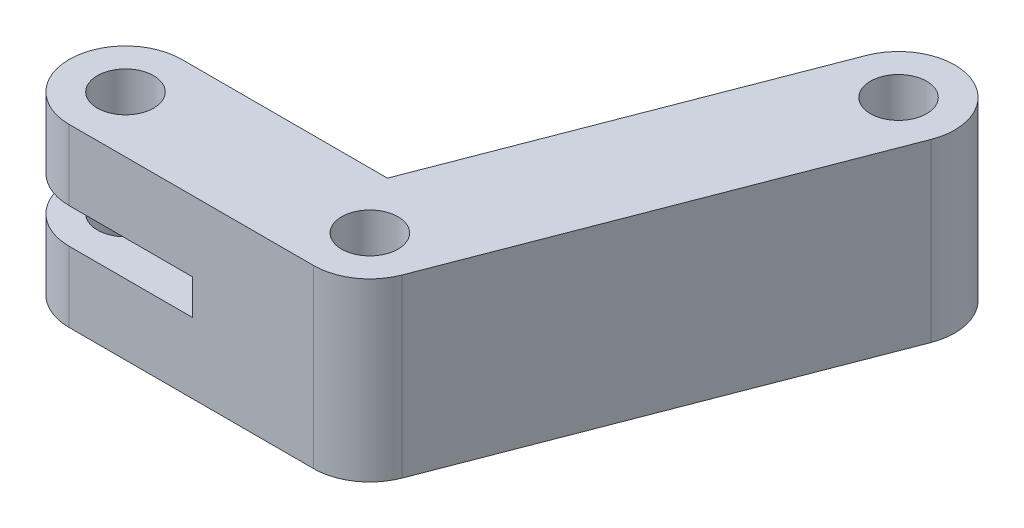
ISO-10303-21;
HEADER;
FILE_DESCRIPTION(('STEP AP214'),'2;1');
FILE_NAME('part.step','',(''),(''),'','','');
FILE_SCHEMA(('AUTOMOTIVE_DESIGN { 1 0 10303 214 1 1 1 1 }'));
ENDSEC;
DATA;
#1=APPLICATION_CONTEXT('core data for automotive mechanical design processes');
#2=APPLICATION_PROTOCOL_DEFINITION('international standard','automotive_design',2000,#1);
#3=PRODUCT_CONTEXT('',#1,'mechanical');
#4=PRODUCT('Part','Part','',(#3));
#5=PRODUCT_RELATED_PRODUCT_CATEGORY('part','',(#4));
#6=PRODUCT_DEFINITION_FORMATION('','',#4);
#7=PRODUCT_DEFINITION_CONTEXT('part definition',#1,'design');
#8=PRODUCT_DEFINITION('design','',#6,#7);
#9=PRODUCT_DEFINITION_SHAPE('','',#8);
#10=(LENGTH_UNIT() NAMED_UNIT(*) SI_UNIT(.MILLI.,.METRE.));
#11=(NAMED_UNIT(*) PLANE_ANGLE_UNIT() SI_UNIT($,.RADIAN.));
#12=(NAMED_UNIT(*) SI_UNIT($,.STERADIAN.) SOLID_ANGLE_UNIT());
#13=UNCERTAINTY_MEASURE_WITH_UNIT(LENGTH_MEASURE(1.E-05),#10,'distance_accuracy_value','');
#14=(GEOMETRIC_REPRESENTATION_CONTEXT(3) GLOBAL_UNCERTAINTY_ASSIGNED_CONTEXT((#13)) GLOBAL_UNIT_ASSIGNED_CONTEXT((#10,
#11,#12)) REPRESENTATION_CONTEXT('',''));
#15=CARTESIAN_POINT('',(0.,0.,0.));
#16=DIRECTION('',(0.,0.,1.));
#17=DIRECTION('',(1.,0.,0.));
#18=AXIS2_PLACEMENT_3D('',#15,#16,#17);
#19=CARTESIAN_POINT('',(-34.72,12.5,0.));
#20=DIRECTION('',(0.,-1.,0.));
#21=DIRECTION('',(0.,0.,-1.));
#22=AXIS2_PLACEMENT_3D('',#19,#20,#21);
#23=CYLINDRICAL_SURFACE('',#22,8.);
#24=DIRECTION('',(0.,-1.,0.));
#25=VECTOR('',#24,1.);
#26=CARTESIAN_POINT('',(-34.72,12.5,-8.));
#27=LINE('',#26,#25);
#28=CARTESIAN_POINT('',(-34.72,12.5,-8.));
#29=VERTEX_POINT('',#28);
#30=CARTESIAN_POINT('',(-34.72,2.5,-8.));
#31=VERTEX_POINT('',#30);
#32=EDGE_CURVE('E179',#29,#31,#27,.T.);
#33=ORIENTED_EDGE('',*,*,#32,.T.);
#34=CARTESIAN_POINT('',(-34.72,2.5,0.));
#35=DIRECTION('',(0.,1.,0.));
#36=DIRECTION('',(0.,0.,1.));
#37=AXIS2_PLACEMENT_3D('',#34,#35,#36);
#38=CIRCLE('',#37,8.);
#39=CARTESIAN_POINT('',(-34.72,2.5,8.));
#40=VERTEX_POINT('',#39);
#41=EDGE_CURVE('E331',#40,#31,#38,.F.);
#42=ORIENTED_EDGE('',*,*,#41,.F.);
#43=DIRECTION('',(0.,-1.,0.));
#44=VECTOR('',#43,1.);
#45=CARTESIAN_POINT('',(-34.72,12.5,8.));
#46=LINE('',#45,#44);
#47=CARTESIAN_POINT('',(-34.72,12.5,8.));
#48=VERTEX_POINT('',#47);
#49=EDGE_CURVE('E127',#48,#40,#46,.T.);
#50=ORIENTED_EDGE('',*,*,#49,.F.);
#51=CARTESIAN_POINT('',(-34.72,12.5,0.));
#52=DIRECTION('',(0.,1.,0.));
#53=DIRECTION('',(0.,0.,1.));
#54=AXIS2_PLACEMENT_3D('',#51,#52,#53);
#55=CIRCLE('',#54,8.);
#56=EDGE_CURVE('E201',#29,#48,#55,.T.);
#57=ORIENTED_EDGE('',*,*,#56,.F.);
#58=EDGE_LOOP('',(#33,#42,#50,#57));
#59=FACE_BOUND('',#58,.T.);
#60=ADVANCED_FACE('F123',(#59),#23,.T.);
#61=CARTESIAN_POINT('',(-34.72,12.5,0.));
#62=DIRECTION('',(0.,-1.,0.));
#63=DIRECTION('',(0.,0.,-1.));
#64=AXIS2_PLACEMENT_3D('',#61,#62,#63);
#65=CYLINDRICAL_SURFACE('',#64,4.);
#66=CARTESIAN_POINT('',(-34.72,2.5,0.));
#67=DIRECTION('',(0.,1.,0.));
#68=DIRECTION('',(0.,0.,1.));
#69=AXIS2_PLACEMENT_3D('',#66,#67,#68);
#70=CIRCLE('',#69,4.);
#71=CARTESIAN_POINT('',(-34.72,2.5,4.));
#72=VERTEX_POINT('',#71);
#73=EDGE_CURVE('E345',#72,#72,#70,.F.);
#74=ORIENTED_EDGE('',*,*,#73,.T.);
#75=EDGE_LOOP('',(#74));
#76=FACE_BOUND('',#75,.T.);
#77=CARTESIAN_POINT('',(-34.72,12.5,0.));
#78=DIRECTION('',(0.,1.,0.));
#79=DIRECTION('',(0.,0.,1.));
#80=AXIS2_PLACEMENT_3D('',#77,#78,#79);
#81=CIRCLE('',#80,4.);
#82=CARTESIAN_POINT('',(-34.72,12.5,4.));
#83=VERTEX_POINT('',#82);
#84=EDGE_CURVE('E194',#83,#83,#81,.T.);
#85=ORIENTED_EDGE('',*,*,#84,.T.);
#86=EDGE_LOOP('',(#85));
#87=FACE_BOUND('',#86,.T.);
#88=ADVANCED_FACE('F377',(#76,#87),#65,.F.);
#89=CARTESIAN_POINT('',(0.,12.5,0.));
#90=DIRECTION('',(0.,-1.,0.));
#91=DIRECTION('',(0.,0.,-1.));
#92=AXIS2_PLACEMENT_3D('',#89,#90,#91);
#93=CYLINDRICAL_SURFACE('',#92,8.);
#94=CARTESIAN_POINT('',(0.,12.5,0.));
#95=DIRECTION('',(0.,1.,0.));
#96=DIRECTION('',(0.,0.,1.));
#97=AXIS2_PLACEMENT_3D('',#94,#95,#96);
#98=CIRCLE('',#97,8.);
#99=CARTESIAN_POINT('',(0.,12.5,8.));
#100=VERTEX_POINT('',#99);
#101=CARTESIAN_POINT('',(7.4654515483824,12.5,2.87524489022324));
#102=VERTEX_POINT('',#101);
#103=EDGE_CURVE('E234',#100,#102,#98,.T.);
#104=ORIENTED_EDGE('',*,*,#103,.F.);
#105=DIRECTION('',(0.,-1.,0.));
#106=VECTOR('',#105,1.);
#107=CARTESIAN_POINT('',(0.,12.5,8.));
#108=LINE('',#107,#106);
#109=CARTESIAN_POINT('',(0.,-12.5,8.));
#110=VERTEX_POINT('',#109);
#111=EDGE_CURVE('E12',#100,#110,#108,.T.);
#112=ORIENTED_EDGE('',*,*,#111,.T.);
#113=CARTESIAN_POINT('',(0.,-12.5,0.));
#114=DIRECTION('',(0.,1.,0.));
#115=DIRECTION('',(0.,0.,1.));
#116=AXIS2_PLACEMENT_3D('',#113,#114,#115);
#117=CIRCLE('',#116,8.);
#118=CARTESIAN_POINT('',(7.4654515483824,-12.5,2.87524489022324));
#119=VERTEX_POINT('',#118);
#120=EDGE_CURVE('E230',#110,#119,#117,.T.);
#121=ORIENTED_EDGE('',*,*,#120,.T.);
#122=DIRECTION('',(0.,-1.,0.));
#123=VECTOR('',#122,1.);
#124=CARTESIAN_POINT('',(7.4654515483824,12.5,2.87524489022324));
#125=LINE('',#124,#123);
#126=EDGE_CURVE('E272',#102,#119,#125,.T.);
#127=ORIENTED_EDGE('',*,*,#126,.F.);
#128=EDGE_LOOP('',(#104,#112,#121,#127));
#129=FACE_BOUND('',#128,.T.);
#130=ADVANCED_FACE('F382',(#129),#93,.T.);
#131=CARTESIAN_POINT('',(0.,-12.5,0.));
#132=DIRECTION('',(0.,1.,0.));
#133=DIRECTION('',(0.,0.,1.));
#134=AXIS2_PLACEMENT_3D('',#131,#132,#133);
#135=PLANE('',#134);
#136=CARTESIAN_POINT('',(0.,-12.5,0.));
#137=DIRECTION('',(0.,1.,0.));
#138=DIRECTION('',(0.,0.,1.));
#139=AXIS2_PLACEMENT_3D('',#136,#137,#138);
#140=CIRCLE('',#139,4.);
#141=CARTESIAN_POINT('',(0.,-12.5,4.));
#142=VERTEX_POINT('',#141);
#143=EDGE_CURVE('E347',#142,#142,#140,.T.);
#144=ORIENTED_EDGE('',*,*,#143,.T.);
#145=EDGE_LOOP('',(#144));
#146=FACE_BOUND('',#145,.T.);
#147=ORIENTED_EDGE('',*,*,#120,.F.);
#148=DIRECTION('',(1.,0.,0.));
#149=VECTOR('',#148,1.);
#150=CARTESIAN_POINT('',(-34.72,-12.5,8.));
#151=LINE('',#150,#149);
#152=CARTESIAN_POINT('',(-34.72,-12.5,8.));
#153=VERTEX_POINT('',#152);
#154=EDGE_CURVE('E192',#153,#110,#151,.T.);
#155=ORIENTED_EDGE('',*,*,#154,.F.);
#156=CARTESIAN_POINT('',(-34.72,-12.5,0.));
#157=DIRECTION('',(0.,1.,0.));
#158=DIRECTION('',(0.,0.,1.));
#159=AXIS2_PLACEMENT_3D('',#156,#157,#158);
#160=CIRCLE('',#159,8.);
#161=CARTESIAN_POINT('',(-34.72,-12.5,-8.));
#162=VERTEX_POINT('',#161);
#163=EDGE_CURVE('E171',#162,#153,#160,.T.);
#164=ORIENTED_EDGE('',*,*,#163,.F.);
#165=DIRECTION('',(1.,0.,0.));
#166=VECTOR('',#165,1.);
#167=CARTESIAN_POINT('',(-34.72,-12.5,-8.));
#168=LINE('',#167,#166);
#169=CARTESIAN_POINT('',(-5.49170276071211,-12.5,-8.));
#170=VERTEX_POINT('',#169);
#171=EDGE_CURVE('E190',#162,#170,#168,.T.);
#172=ORIENTED_EDGE('',*,*,#171,.T.);
#173=DIRECTION('',(0.359405611277904,0.,-0.9331814435478));
#174=VECTOR('',#173,1.);
#175=CARTESIAN_POINT('',(-7.4654515483824,-12.5,-2.87524489022324));
#176=LINE('',#175,#174);
#177=CARTESIAN_POINT('',(13.4245484516176,-12.5,-57.1152448902232));
#178=VERTEX_POINT('',#177);
#179=EDGE_CURVE('E239',#170,#178,#176,.T.);
#180=ORIENTED_EDGE('',*,*,#179,.T.);
#181=CARTESIAN_POINT('',(20.89,-12.5,-54.24));
#182=DIRECTION('',(0.,1.,0.));
#183=DIRECTION('',(0.,0.,1.));
#184=AXIS2_PLACEMENT_3D('',#181,#182,#183);
#185=CIRCLE('',#184,8.);
#186=CARTESIAN_POINT('',(28.3554515483824,-12.5,-51.3647551097768));
#187=VERTEX_POINT('',#186);
#188=EDGE_CURVE('E259',#187,#178,#185,.T.);
#189=ORIENTED_EDGE('',*,*,#188,.F.);
#190=DIRECTION('',(0.359405611277904,0.,-0.9331814435478));
#191=VECTOR('',#190,1.);
#192=CARTESIAN_POINT('',(7.4654515483824,-12.5,2.87524489022324));
#193=LINE('',#192,#191);
#194=EDGE_CURVE('E255',#119,#187,#193,.T.);
#195=ORIENTED_EDGE('',*,*,#194,.F.);
#196=EDGE_LOOP('',(#147,#155,#164,#172,#180,#189,#195));
#197=FACE_BOUND('',#196,.T.);
#198=CARTESIAN_POINT('',(20.89,-12.5,-54.24));
#199=DIRECTION('',(0.,1.,0.));
#200=DIRECTION('',(0.,0.,1.));
#201=AXIS2_PLACEMENT_3D('',#198,#199,#200);
#202=CIRCLE('',#201,4.);
#203=CARTESIAN_POINT('',(20.89,-12.5,-50.24));
#204=VERTEX_POINT('',#203);
#205=EDGE_CURVE('E219',#204,#204,#202,.T.);
#206=ORIENTED_EDGE('',*,*,#205,.T.);
#207=EDGE_LOOP('',(#206));
#208=FACE_BOUND('',#207,.T.);
#209=CARTESIAN_POINT('',(-34.72,-12.5,0.));
#210=DIRECTION('',(0.,1.,0.));
#211=DIRECTION('',(0.,0.,1.));
#212=AXIS2_PLACEMENT_3D('',#209,#210,#211);
#213=CIRCLE('',#212,4.);
#214=CARTESIAN_POINT('',(-34.72,-12.5,4.));
#215=VERTEX_POINT('',#214);
#216=EDGE_CURVE('E281',#215,#215,#213,.T.);
#217=ORIENTED_EDGE('',*,*,#216,.T.);
#218=EDGE_LOOP('',(#217));
#219=FACE_BOUND('',#218,.T.);
#220=ADVANCED_FACE('F186',(#146,#197,#208,#219),#135,.F.);
#221=CARTESIAN_POINT('',(-34.72,12.5,8.));
#222=DIRECTION('',(0.,0.,-1.));
#223=DIRECTION('',(-1.,0.,0.));
#224=AXIS2_PLACEMENT_3D('',#221,#222,#223);
#225=PLANE('',#224);
#226=ORIENTED_EDGE('',*,*,#49,.T.);
#227=DIRECTION('',(-1.,0.,0.));
#228=VECTOR('',#227,1.);
#229=CARTESIAN_POINT('',(-42.72,2.5,8.));
#230=LINE('',#229,#228);
#231=CARTESIAN_POINT('',(-17.22,2.5,8.));
#232=VERTEX_POINT('',#231);
#233=EDGE_CURVE('E329',#232,#40,#230,.T.);
#234=ORIENTED_EDGE('',*,*,#233,.F.);
#235=DIRECTION('',(0.,1.,0.));
#236=VECTOR('',#235,1.);
#237=CARTESIAN_POINT('',(-17.22,2.5,8.));
#238=LINE('',#237,#236);
#239=CARTESIAN_POINT('',(-17.22,-2.5,8.));
#240=VERTEX_POINT('',#239);
#241=EDGE_CURVE('E337',#240,#232,#238,.T.);
#242=ORIENTED_EDGE('',*,*,#241,.F.);
#243=DIRECTION('',(1.,0.,0.));
#244=VECTOR('',#243,1.);
#245=CARTESIAN_POINT('',(-17.22,-2.5,8.));
#246=LINE('',#245,#244);
#247=CARTESIAN_POINT('',(-34.72,-2.5,8.));
#248=VERTEX_POINT('',#247);
#249=EDGE_CURVE('E360',#248,#240,#246,.T.);
#250=ORIENTED_EDGE('',*,*,#249,.F.);
#251=EDGE_CURVE('E211',#248,#153,#46,.T.);
#252=ORIENTED_EDGE('',*,*,#251,.T.);
#253=ORIENTED_EDGE('',*,*,#154,.T.);
#254=ORIENTED_EDGE('',*,*,#111,.F.);
#255=DIRECTION('',(1.,0.,0.));
#256=VECTOR('',#255,1.);
#257=CARTESIAN_POINT('',(-34.72,12.5,8.));
#258=LINE('',#257,#256);
#259=EDGE_CURVE('E206',#48,#100,#258,.T.);
#260=ORIENTED_EDGE('',*,*,#259,.F.);
#261=EDGE_LOOP('',(#226,#234,#242,#250,#252,#253,#254,#260));
#262=FACE_BOUND('',#261,.T.);
#263=ADVANCED_FACE('F375',(#262),#225,.F.);
#264=ORIENTED_EDGE('',*,*,#251,.F.);
#265=CARTESIAN_POINT('',(-34.72,-2.5,0.));
#266=DIRECTION('',(0.,-1.,0.));
#267=DIRECTION('',(1.,0.,0.));
#268=AXIS2_PLACEMENT_3D('',#265,#266,#267);
#269=CIRCLE('',#268,8.);
#270=CARTESIAN_POINT('',(-34.72,-2.5,-8.));
#271=VERTEX_POINT('',#270);
#272=EDGE_CURVE('E174',#271,#248,#269,.F.);
#273=ORIENTED_EDGE('',*,*,#272,.F.);
#274=EDGE_CURVE('E168',#271,#162,#27,.T.);
#275=ORIENTED_EDGE('',*,*,#274,.T.);
#276=ORIENTED_EDGE('',*,*,#163,.T.);
#277=EDGE_LOOP('',(#264,#273,#275,#276));
#278=FACE_BOUND('',#277,.T.);
#279=ADVANCED_FACE('F125',(#278),#23,.T.);
#280=CARTESIAN_POINT('',(-34.72,12.5,-8.));
#281=DIRECTION('',(0.,0.,-1.));
#282=DIRECTION('',(-1.,0.,0.));
#283=AXIS2_PLACEMENT_3D('',#280,#281,#282);
#284=PLANE('',#283);
#285=DIRECTION('',(-1.,0.,0.));
#286=VECTOR('',#285,1.);
#287=CARTESIAN_POINT('',(-42.72,2.5,-8.));
#288=LINE('',#287,#286);
#289=CARTESIAN_POINT('',(-17.22,2.5,-8.));
#290=VERTEX_POINT('',#289);
#291=EDGE_CURVE('E140',#290,#31,#288,.T.);
#292=ORIENTED_EDGE('',*,*,#291,.T.);
#293=ORIENTED_EDGE('',*,*,#32,.F.);
#294=DIRECTION('',(1.,0.,0.));
#295=VECTOR('',#294,1.);
#296=CARTESIAN_POINT('',(-34.72,12.5,-8.));
#297=LINE('',#296,#295);
#298=CARTESIAN_POINT('',(-5.49170276071211,12.5,-8.));
#299=VERTEX_POINT('',#298);
#300=EDGE_CURVE('E180',#29,#299,#297,.T.);
#301=ORIENTED_EDGE('',*,*,#300,.T.);
#302=DIRECTION('',(0.,-1.,0.));
#303=VECTOR('',#302,1.);
#304=CARTESIAN_POINT('',(-5.49170276071211,12.5,-8.));
#305=LINE('',#304,#303);
#306=EDGE_CURVE('E133',#299,#170,#305,.T.);
#307=ORIENTED_EDGE('',*,*,#306,.T.);
#308=ORIENTED_EDGE('',*,*,#171,.F.);
#309=ORIENTED_EDGE('',*,*,#274,.F.);
#310=DIRECTION('',(1.,0.,0.));
#311=VECTOR('',#310,1.);
#312=CARTESIAN_POINT('',(-17.22,-2.5,-8.));
#313=LINE('',#312,#311);
#314=CARTESIAN_POINT('',(-17.22,-2.5,-8.));
#315=VERTEX_POINT('',#314);
#316=EDGE_CURVE('E284',#271,#315,#313,.T.);
#317=ORIENTED_EDGE('',*,*,#316,.T.);
#318=DIRECTION('',(0.,1.,0.));
#319=VECTOR('',#318,1.);
#320=CARTESIAN_POINT('',(-17.22,2.5,-8.));
#321=LINE('',#320,#319);
#322=EDGE_CURVE('E354',#315,#290,#321,.T.);
#323=ORIENTED_EDGE('',*,*,#322,.T.);
#324=EDGE_LOOP('',(#292,#293,#301,#307,#308,#309,#317,#323));
#325=FACE_BOUND('',#324,.T.);
#326=ADVANCED_FACE('F197',(#325),#284,.T.);
#327=CARTESIAN_POINT('',(-34.72,-2.5,0.));
#328=DIRECTION('',(0.,-1.,0.));
#329=DIRECTION('',(1.,0.,0.));
#330=AXIS2_PLACEMENT_3D('',#327,#328,#329);
#331=CIRCLE('',#330,4.);
#332=CARTESIAN_POINT('',(-30.72,-2.5,0.));
#333=VERTEX_POINT('',#332);
#334=EDGE_CURVE('E340',#333,#333,#331,.F.);
#335=ORIENTED_EDGE('',*,*,#334,.T.);
#336=EDGE_LOOP('',(#335));
#337=FACE_BOUND('',#336,.T.);
#338=ORIENTED_EDGE('',*,*,#216,.F.);
#339=EDGE_LOOP('',(#338));
#340=FACE_BOUND('',#339,.T.);
#341=ADVANCED_FACE('F389',(#337,#340),#65,.F.);
#342=CARTESIAN_POINT('',(20.89,12.5,-54.24));
#343=DIRECTION('',(0.,-1.,0.));
#344=DIRECTION('',(0.,0.,-1.));
#345=AXIS2_PLACEMENT_3D('',#342,#343,#344);
#346=CYLINDRICAL_SURFACE('',#345,4.);
#347=CARTESIAN_POINT('',(20.89,12.5,-54.24));
#348=DIRECTION('',(0.,1.,0.));
#349=DIRECTION('',(0.,0.,1.));
#350=AXIS2_PLACEMENT_3D('',#347,#348,#349);
#351=CIRCLE('',#350,4.);
#352=CARTESIAN_POINT('',(20.89,12.5,-50.24));
#353=VERTEX_POINT('',#352);
#354=EDGE_CURVE('E225',#353,#353,#351,.T.);
#355=ORIENTED_EDGE('',*,*,#354,.T.);
#356=EDGE_LOOP('',(#355));
#357=FACE_BOUND('',#356,.T.);
#358=ORIENTED_EDGE('',*,*,#205,.F.);
#359=EDGE_LOOP('',(#358));
#360=FACE_BOUND('',#359,.T.);
#361=ADVANCED_FACE('F474',(#357,#360),#346,.F.);
#362=CARTESIAN_POINT('',(20.89,12.5,-54.24));
#363=DIRECTION('',(0.,-1.,0.));
#364=DIRECTION('',(0.,0.,-1.));
#365=AXIS2_PLACEMENT_3D('',#362,#363,#364);
#366=CYLINDRICAL_SURFACE('',#365,8.);
#367=ORIENTED_EDGE('',*,*,#188,.T.);
#368=DIRECTION('',(0.,-1.,0.));
#369=VECTOR('',#368,1.);
#370=CARTESIAN_POINT('',(13.4245484516176,12.5,-57.1152448902232));
#371=LINE('',#370,#369);
#372=CARTESIAN_POINT('',(13.4245484516176,12.5,-57.1152448902232));
#373=VERTEX_POINT('',#372);
#374=EDGE_CURVE('E251',#373,#178,#371,.T.);
#375=ORIENTED_EDGE('',*,*,#374,.F.);
#376=CARTESIAN_POINT('',(20.89,12.5,-54.24));
#377=DIRECTION('',(0.,1.,0.));
#378=DIRECTION('',(0.,0.,1.));
#379=AXIS2_PLACEMENT_3D('',#376,#377,#378);
#380=CIRCLE('',#379,8.);
#381=CARTESIAN_POINT('',(28.3554515483824,12.5,-51.3647551097768));
#382=VERTEX_POINT('',#381);
#383=EDGE_CURVE('E243',#382,#373,#380,.T.);
#384=ORIENTED_EDGE('',*,*,#383,.F.);
#385=DIRECTION('',(0.,-1.,0.));
#386=VECTOR('',#385,1.);
#387=CARTESIAN_POINT('',(28.3554515483824,12.5,-51.3647551097768));
#388=LINE('',#387,#386);
#389=EDGE_CURVE('E268',#382,#187,#388,.T.);
#390=ORIENTED_EDGE('',*,*,#389,.T.);
#391=EDGE_LOOP('',(#367,#375,#384,#390));
#392=FACE_BOUND('',#391,.T.);
#393=ADVANCED_FACE('F425',(#392),#366,.T.);
#394=CARTESIAN_POINT('',(0.,12.5,0.));
#395=DIRECTION('',(0.,1.,0.));
#396=DIRECTION('',(0.,0.,1.));
#397=AXIS2_PLACEMENT_3D('',#394,#395,#396);
#398=PLANE('',#397);
#399=CARTESIAN_POINT('',(0.,12.5,0.));
#400=DIRECTION('',(0.,1.,0.));
#401=DIRECTION('',(0.,0.,1.));
#402=AXIS2_PLACEMENT_3D('',#399,#400,#401);
#403=CIRCLE('',#402,4.);
#404=CARTESIAN_POINT('',(0.,12.5,4.));
#405=VERTEX_POINT('',#404);
#406=EDGE_CURVE('E541',#405,#405,#403,.T.);
#407=ORIENTED_EDGE('',*,*,#406,.F.);
#408=EDGE_LOOP('',(#407));
#409=FACE_BOUND('',#408,.T.);
#410=ORIENTED_EDGE('',*,*,#259,.T.);
#411=ORIENTED_EDGE('',*,*,#103,.T.);
#412=DIRECTION('',(0.359405611277904,0.,-0.9331814435478));
#413=VECTOR('',#412,1.);
#414=CARTESIAN_POINT('',(7.4654515483824,12.5,2.87524489022324));
#415=LINE('',#414,#413);
#416=EDGE_CURVE('E238',#102,#382,#415,.T.);
#417=ORIENTED_EDGE('',*,*,#416,.T.);
#418=ORIENTED_EDGE('',*,*,#383,.T.);
#419=DIRECTION('',(0.359405611277904,0.,-0.9331814435478));
#420=VECTOR('',#419,1.);
#421=CARTESIAN_POINT('',(-7.4654515483824,12.5,-2.87524489022324));
#422=LINE('',#421,#420);
#423=EDGE_CURVE('E247',#299,#373,#422,.T.);
#424=ORIENTED_EDGE('',*,*,#423,.F.);
#425=ORIENTED_EDGE('',*,*,#300,.F.);
#426=ORIENTED_EDGE('',*,*,#56,.T.);
#427=EDGE_LOOP('',(#410,#411,#417,#418,#424,#425,#426));
#428=FACE_BOUND('',#427,.T.);
#429=ORIENTED_EDGE('',*,*,#354,.F.);
#430=EDGE_LOOP('',(#429));
#431=FACE_BOUND('',#430,.T.);
#432=ORIENTED_EDGE('',*,*,#84,.F.);
#433=EDGE_LOOP('',(#432));
#434=FACE_BOUND('',#433,.T.);
#435=ADVANCED_FACE('F292',(#409,#428,#431,#434),#398,.T.);
#436=CARTESIAN_POINT('',(-7.4654515483824,12.5,-2.87524489022324));
#437=DIRECTION('',(-0.9331814435478,0.,-0.359405611277904));
#438=DIRECTION('',(-0.359405611277904,0.,0.9331814435478));
#439=AXIS2_PLACEMENT_3D('',#436,#437,#438);
#440=PLANE('',#439);
#441=ORIENTED_EDGE('',*,*,#306,.F.);
#442=ORIENTED_EDGE('',*,*,#423,.T.);
#443=ORIENTED_EDGE('',*,*,#374,.T.);
#444=ORIENTED_EDGE('',*,*,#179,.F.);
#445=EDGE_LOOP('',(#441,#442,#443,#444));
#446=FACE_BOUND('',#445,.T.);
#447=ADVANCED_FACE('F298',(#446),#440,.T.);
#448=CARTESIAN_POINT('',(7.4654515483824,12.5,2.87524489022324));
#449=DIRECTION('',(-0.9331814435478,0.,-0.359405611277904));
#450=DIRECTION('',(-0.359405611277904,0.,0.9331814435478));
#451=AXIS2_PLACEMENT_3D('',#448,#449,#450);
#452=PLANE('',#451);
#453=ORIENTED_EDGE('',*,*,#194,.T.);
#454=ORIENTED_EDGE('',*,*,#389,.F.);
#455=ORIENTED_EDGE('',*,*,#416,.F.);
#456=ORIENTED_EDGE('',*,*,#126,.T.);
#457=EDGE_LOOP('',(#453,#454,#455,#456));
#458=FACE_BOUND('',#457,.T.);
#459=ADVANCED_FACE('F404',(#458),#452,.F.);
#460=CARTESIAN_POINT('',(-42.72,2.5,-62.241));
#461=DIRECTION('',(0.,1.,0.));
#462=DIRECTION('',(0.,0.,1.));
#463=AXIS2_PLACEMENT_3D('',#460,#461,#462);
#464=PLANE('',#463);
#465=ORIENTED_EDGE('',*,*,#73,.F.);
#466=EDGE_LOOP('',(#465));
#467=FACE_BOUND('',#466,.T.);
#468=ORIENTED_EDGE('',*,*,#41,.T.);
#469=ORIENTED_EDGE('',*,*,#291,.F.);
#470=DIRECTION('',(0.,0.,1.));
#471=VECTOR('',#470,1.);
#472=CARTESIAN_POINT('',(-17.22,2.5,-62.241));
#473=LINE('',#472,#471);
#474=EDGE_CURVE('E332',#290,#232,#473,.T.);
#475=ORIENTED_EDGE('',*,*,#474,.T.);
#476=ORIENTED_EDGE('',*,*,#233,.T.);
#477=EDGE_LOOP('',(#468,#469,#475,#476));
#478=FACE_BOUND('',#477,.T.);
#479=ADVANCED_FACE('F330',(#467,#478),#464,.F.);
#480=CARTESIAN_POINT('',(-17.22,-2.5,-62.241));
#481=DIRECTION('',(0.,-1.,0.));
#482=DIRECTION('',(1.,0.,0.));
#483=AXIS2_PLACEMENT_3D('',#480,#481,#482);
#484=PLANE('',#483);
#485=ORIENTED_EDGE('',*,*,#334,.F.);
#486=EDGE_LOOP('',(#485));
#487=FACE_BOUND('',#486,.T.);
#488=ORIENTED_EDGE('',*,*,#272,.T.);
#489=ORIENTED_EDGE('',*,*,#249,.T.);
#490=DIRECTION('',(0.,0.,1.));
#491=VECTOR('',#490,1.);
#492=CARTESIAN_POINT('',(-17.22,-2.5,-62.241));
#493=LINE('',#492,#491);
#494=EDGE_CURVE('E336',#315,#240,#493,.T.);
#495=ORIENTED_EDGE('',*,*,#494,.F.);
#496=ORIENTED_EDGE('',*,*,#316,.F.);
#497=EDGE_LOOP('',(#488,#489,#495,#496));
#498=FACE_BOUND('',#497,.T.);
#499=ADVANCED_FACE('F372',(#487,#498),#484,.F.);
#500=CARTESIAN_POINT('',(-17.22,2.5,-62.241));
#501=DIRECTION('',(1.,0.,0.));
#502=DIRECTION('',(0.,0.,-1.));
#503=AXIS2_PLACEMENT_3D('',#500,#501,#502);
#504=PLANE('',#503);
#505=ORIENTED_EDGE('',*,*,#494,.T.);
#506=ORIENTED_EDGE('',*,*,#241,.T.);
#507=ORIENTED_EDGE('',*,*,#474,.F.);
#508=ORIENTED_EDGE('',*,*,#322,.F.);
#509=EDGE_LOOP('',(#505,#506,#507,#508));
#510=FACE_BOUND('',#509,.T.);
#511=ADVANCED_FACE('F374',(#510),#504,.F.);
#512=CARTESIAN_POINT('',(0.,-12.5,0.));
#513=DIRECTION('',(0.,1.,0.));
#514=DIRECTION('',(0.,0.,1.));
#515=AXIS2_PLACEMENT_3D('',#512,#513,#514);
#516=CYLINDRICAL_SURFACE('',#515,4.);
#517=ORIENTED_EDGE('',*,*,#143,.F.);
#518=EDGE_LOOP('',(#517));
#519=FACE_BOUND('',#518,.T.);
#520=ORIENTED_EDGE('',*,*,#406,.T.);
#521=EDGE_LOOP('',(#520));
#522=FACE_BOUND('',#521,.T.);
#523=ADVANCED_FACE('F435',(#519,#522),#516,.F.);
#524=CLOSED_SHELL('',(#60,#88,#130,#220,#263,#279,#326,#341,#361,#393,#435,#447,#459,#479,#499,
#511,#523));
#525=MANIFOLD_SOLID_BREP('B2',#524);
#526=ADVANCED_BREP_SHAPE_REPRESENTATION('',(#18,#525),#14);
#527=SHAPE_DEFINITION_REPRESENTATION(#9,#526);
ENDSEC;
END-ISO-10303-21;
